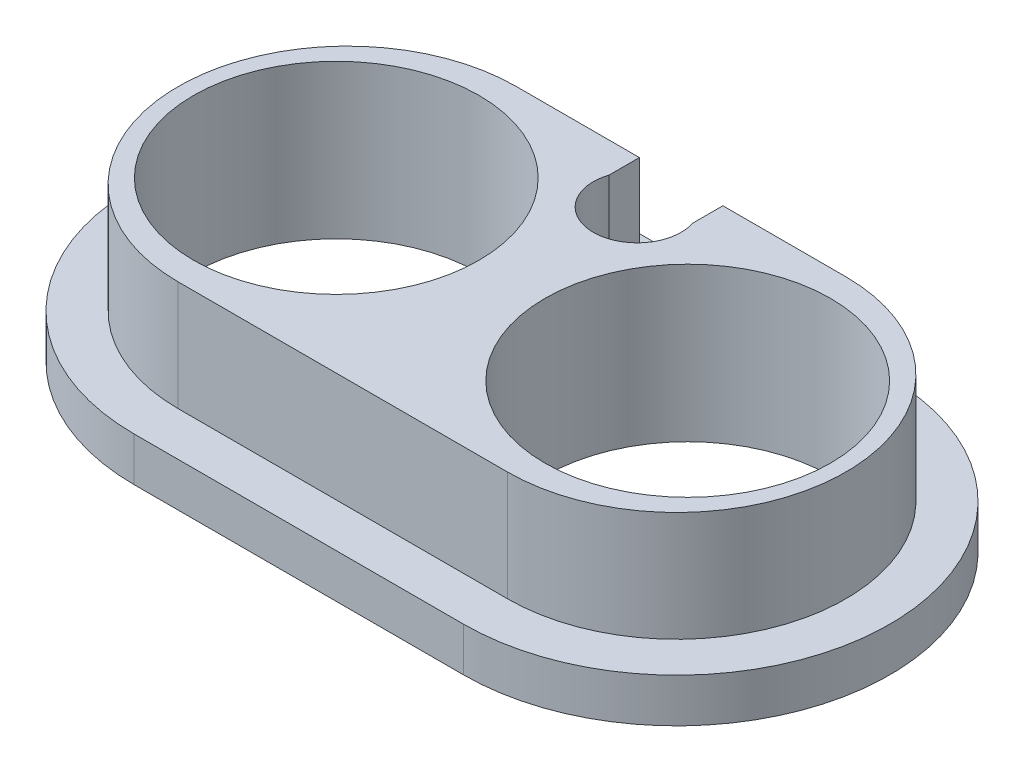
ISO-10303-21;
HEADER;
FILE_DESCRIPTION(('STEP AP214'),'2;1');
FILE_NAME('part.step','',(''),(''),'','','');
FILE_SCHEMA(('AUTOMOTIVE_DESIGN { 1 0 10303 214 1 1 1 1 }'));
ENDSEC;
DATA;
#1=APPLICATION_CONTEXT('core data for automotive mechanical design processes');
#2=APPLICATION_PROTOCOL_DEFINITION('international standard','automotive_design',2000,#1);
#3=PRODUCT_CONTEXT('',#1,'mechanical');
#4=PRODUCT('Part','Part','',(#3));
#5=PRODUCT_RELATED_PRODUCT_CATEGORY('part','',(#4));
#6=PRODUCT_DEFINITION_FORMATION('','',#4);
#7=PRODUCT_DEFINITION_CONTEXT('part definition',#1,'design');
#8=PRODUCT_DEFINITION('design','',#6,#7);
#9=PRODUCT_DEFINITION_SHAPE('','',#8);
#10=(LENGTH_UNIT() NAMED_UNIT(*) SI_UNIT(.MILLI.,.METRE.));
#11=(NAMED_UNIT(*) PLANE_ANGLE_UNIT() SI_UNIT($,.RADIAN.));
#12=(NAMED_UNIT(*) SI_UNIT($,.STERADIAN.) SOLID_ANGLE_UNIT());
#13=UNCERTAINTY_MEASURE_WITH_UNIT(LENGTH_MEASURE(1.E-05),#10,'distance_accuracy_value','');
#14=(GEOMETRIC_REPRESENTATION_CONTEXT(3) GLOBAL_UNCERTAINTY_ASSIGNED_CONTEXT((#13)) GLOBAL_UNIT_ASSIGNED_CONTEXT((#10,
#11,#12)) REPRESENTATION_CONTEXT('',''));
#15=CARTESIAN_POINT('',(0.,0.,0.));
#16=DIRECTION('',(0.,0.,1.));
#17=DIRECTION('',(1.,0.,0.));
#18=AXIS2_PLACEMENT_3D('',#15,#16,#17);
#19=CARTESIAN_POINT('',(-7.5,-2.,-9.7));
#20=DIRECTION('',(0.,0.,-1.));
#21=DIRECTION('',(-1.,0.,0.));
#22=AXIS2_PLACEMENT_3D('',#19,#20,#21);
#23=PLANE('',#22);
#24=DIRECTION('',(0.,-1.,0.));
#25=VECTOR('',#24,1.);
#26=CARTESIAN_POINT('',(1.9,5.001,-9.7));
#27=LINE('',#26,#25);
#28=CARTESIAN_POINT('',(1.9,0.,-9.7));
#29=VERTEX_POINT('',#28);
#30=CARTESIAN_POINT('',(1.9,-2.,-9.7));
#31=VERTEX_POINT('',#30);
#32=EDGE_CURVE('E176',#29,#31,#27,.T.);
#33=ORIENTED_EDGE('',*,*,#32,.F.);
#34=DIRECTION('',(-1.,0.,0.));
#35=VECTOR('',#34,1.);
#36=CARTESIAN_POINT('',(-7.5,0.,-9.7));
#37=LINE('',#36,#35);
#38=CARTESIAN_POINT('',(7.5,0.,-9.7));
#39=VERTEX_POINT('',#38);
#40=EDGE_CURVE('E187',#39,#29,#37,.T.);
#41=ORIENTED_EDGE('',*,*,#40,.F.);
#42=DIRECTION('',(0.,1.,0.));
#43=VECTOR('',#42,1.);
#44=CARTESIAN_POINT('',(7.5,-2.,-9.7));
#45=LINE('',#44,#43);
#46=CARTESIAN_POINT('',(7.5,-2.,-9.7));
#47=VERTEX_POINT('',#46);
#48=EDGE_CURVE('E79',#47,#39,#45,.T.);
#49=ORIENTED_EDGE('',*,*,#48,.F.);
#50=DIRECTION('',(-1.,0.,0.));
#51=VECTOR('',#50,1.);
#52=CARTESIAN_POINT('',(-7.5,-2.,-9.7));
#53=LINE('',#52,#51);
#54=EDGE_CURVE('E189',#47,#31,#53,.T.);
#55=ORIENTED_EDGE('',*,*,#54,.T.);
#56=EDGE_LOOP('',(#33,#41,#49,#55));
#57=FACE_BOUND('',#56,.T.);
#58=ADVANCED_FACE('F69',(#57),#23,.T.);
#59=CARTESIAN_POINT('',(-7.5,5.,-7.7));
#60=DIRECTION('',(0.,0.,-1.));
#61=DIRECTION('',(-1.,0.,0.));
#62=AXIS2_PLACEMENT_3D('',#59,#60,#61);
#63=PLANE('',#62);
#64=DIRECTION('',(0.,1.,0.));
#65=VECTOR('',#64,1.);
#66=CARTESIAN_POINT('',(1.9,5.001,-7.7));
#67=LINE('',#66,#65);
#68=CARTESIAN_POINT('',(1.9,0.,-7.7));
#69=VERTEX_POINT('',#68);
#70=CARTESIAN_POINT('',(1.9,5.,-7.7));
#71=VERTEX_POINT('',#70);
#72=EDGE_CURVE('E179',#69,#71,#67,.T.);
#73=ORIENTED_EDGE('',*,*,#72,.T.);
#74=DIRECTION('',(1.,0.,0.));
#75=VECTOR('',#74,1.);
#76=CARTESIAN_POINT('',(-7.5,5.,-7.7));
#77=LINE('',#76,#75);
#78=CARTESIAN_POINT('',(7.5,5.,-7.7));
#79=VERTEX_POINT('',#78);
#80=EDGE_CURVE('E298',#71,#79,#77,.T.);
#81=ORIENTED_EDGE('',*,*,#80,.T.);
#82=DIRECTION('',(0.,-1.,0.));
#83=VECTOR('',#82,1.);
#84=CARTESIAN_POINT('',(7.5,5.,-7.7));
#85=LINE('',#84,#83);
#86=CARTESIAN_POINT('',(7.5,0.,-7.7));
#87=VERTEX_POINT('',#86);
#88=EDGE_CURVE('E308',#79,#87,#85,.T.);
#89=ORIENTED_EDGE('',*,*,#88,.T.);
#90=DIRECTION('',(1.,0.,0.));
#91=VECTOR('',#90,1.);
#92=CARTESIAN_POINT('',(-7.5,0.,-7.7));
#93=LINE('',#92,#91);
#94=EDGE_CURVE('E95',#69,#87,#93,.T.);
#95=ORIENTED_EDGE('',*,*,#94,.F.);
#96=EDGE_LOOP('',(#73,#81,#89,#95));
#97=FACE_BOUND('',#96,.T.);
#98=ADVANCED_FACE('F339',(#97),#63,.T.);
#99=CARTESIAN_POINT('',(-7.5,0.,0.));
#100=DIRECTION('',(0.,1.,0.));
#101=DIRECTION('',(0.,0.,1.));
#102=AXIS2_PLACEMENT_3D('',#99,#100,#101);
#103=PLANE('',#102);
#104=DIRECTION('',(0.,0.,1.));
#105=VECTOR('',#104,1.);
#106=CARTESIAN_POINT('',(1.9,0.,0.));
#107=LINE('',#106,#105);
#108=EDGE_CURVE('E172',#29,#69,#107,.T.);
#109=ORIENTED_EDGE('',*,*,#108,.T.);
#110=ORIENTED_EDGE('',*,*,#94,.T.);
#111=CARTESIAN_POINT('',(7.5,0.,0.));
#112=DIRECTION('',(0.,1.,0.));
#113=DIRECTION('',(0.,0.,1.));
#114=AXIS2_PLACEMENT_3D('',#111,#112,#113);
#115=CIRCLE('',#114,7.7);
#116=CARTESIAN_POINT('',(7.5,0.,7.7));
#117=VERTEX_POINT('',#116);
#118=EDGE_CURVE('E313',#117,#87,#115,.T.);
#119=ORIENTED_EDGE('',*,*,#118,.F.);
#120=DIRECTION('',(1.,0.,0.));
#121=VECTOR('',#120,1.);
#122=CARTESIAN_POINT('',(-7.5,0.,7.7));
#123=LINE('',#122,#121);
#124=CARTESIAN_POINT('',(-7.5,0.,7.7));
#125=VERTEX_POINT('',#124);
#126=EDGE_CURVE('E317',#125,#117,#123,.T.);
#127=ORIENTED_EDGE('',*,*,#126,.F.);
#128=CARTESIAN_POINT('',(-7.5,0.,0.));
#129=DIRECTION('',(0.,1.,0.));
#130=DIRECTION('',(0.,0.,1.));
#131=AXIS2_PLACEMENT_3D('',#128,#129,#130);
#132=CIRCLE('',#131,7.7);
#133=CARTESIAN_POINT('',(-7.5,0.,-7.7));
#134=VERTEX_POINT('',#133);
#135=EDGE_CURVE('E321',#134,#125,#132,.T.);
#136=ORIENTED_EDGE('',*,*,#135,.F.);
#137=CARTESIAN_POINT('',(-1.9,0.,-7.7));
#138=VERTEX_POINT('',#137);
#139=EDGE_CURVE('E309',#134,#138,#93,.T.);
#140=ORIENTED_EDGE('',*,*,#139,.T.);
#141=DIRECTION('',(0.,0.,-1.));
#142=VECTOR('',#141,1.);
#143=CARTESIAN_POINT('',(-1.9,0.,0.));
#144=LINE('',#143,#142);
#145=CARTESIAN_POINT('',(-1.9,0.,-9.7));
#146=VERTEX_POINT('',#145);
#147=EDGE_CURVE('E273',#138,#146,#144,.T.);
#148=ORIENTED_EDGE('',*,*,#147,.T.);
#149=CARTESIAN_POINT('',(-7.5,0.,-9.7));
#150=VERTEX_POINT('',#149);
#151=EDGE_CURVE('E201',#146,#150,#37,.T.);
#152=ORIENTED_EDGE('',*,*,#151,.T.);
#153=CARTESIAN_POINT('',(-7.5,0.,0.));
#154=DIRECTION('',(0.,1.,0.));
#155=DIRECTION('',(0.,0.,1.));
#156=AXIS2_PLACEMENT_3D('',#153,#154,#155);
#157=CIRCLE('',#156,9.7);
#158=CARTESIAN_POINT('',(-7.5,0.,9.7));
#159=VERTEX_POINT('',#158);
#160=EDGE_CURVE('E228',#150,#159,#157,.T.);
#161=ORIENTED_EDGE('',*,*,#160,.T.);
#162=DIRECTION('',(1.,0.,0.));
#163=VECTOR('',#162,1.);
#164=CARTESIAN_POINT('',(-7.5,0.,9.7));
#165=LINE('',#164,#163);
#166=CARTESIAN_POINT('',(7.5,0.,9.7));
#167=VERTEX_POINT('',#166);
#168=EDGE_CURVE('E231',#159,#167,#165,.T.);
#169=ORIENTED_EDGE('',*,*,#168,.T.);
#170=CARTESIAN_POINT('',(7.5,0.,0.));
#171=DIRECTION('',(0.,1.,0.));
#172=DIRECTION('',(0.,0.,1.));
#173=AXIS2_PLACEMENT_3D('',#170,#171,#172);
#174=CIRCLE('',#173,9.7);
#175=EDGE_CURVE('E198',#167,#39,#174,.T.);
#176=ORIENTED_EDGE('',*,*,#175,.T.);
#177=ORIENTED_EDGE('',*,*,#40,.T.);
#178=EDGE_LOOP('',(#109,#110,#119,#127,#136,#140,#148,#152,#161,#169,#176,#177));
#179=FACE_BOUND('',#178,.T.);
#180=ADVANCED_FACE('F195',(#179),#103,.T.);
#181=CARTESIAN_POINT('',(-7.5,-2.,0.));
#182=DIRECTION('',(0.,1.,0.));
#183=DIRECTION('',(0.,0.,1.));
#184=AXIS2_PLACEMENT_3D('',#181,#182,#183);
#185=CYLINDRICAL_SURFACE('',#184,9.7);
#186=ORIENTED_EDGE('',*,*,#160,.F.);
#187=DIRECTION('',(0.,1.,0.));
#188=VECTOR('',#187,1.);
#189=CARTESIAN_POINT('',(-7.5,-2.,-9.7));
#190=LINE('',#189,#188);
#191=CARTESIAN_POINT('',(-7.5,-2.,-9.7));
#192=VERTEX_POINT('',#191);
#193=EDGE_CURVE('E12',#192,#150,#190,.T.);
#194=ORIENTED_EDGE('',*,*,#193,.F.);
#195=CARTESIAN_POINT('',(-7.5,-2.,0.));
#196=DIRECTION('',(0.,1.,0.));
#197=DIRECTION('',(0.,0.,1.));
#198=AXIS2_PLACEMENT_3D('',#195,#196,#197);
#199=CIRCLE('',#198,9.7);
#200=CARTESIAN_POINT('',(-7.5,-2.,9.7));
#201=VERTEX_POINT('',#200);
#202=EDGE_CURVE('E200',#192,#201,#199,.T.);
#203=ORIENTED_EDGE('',*,*,#202,.T.);
#204=DIRECTION('',(0.,1.,0.));
#205=VECTOR('',#204,1.);
#206=CARTESIAN_POINT('',(-7.5,-2.,9.7));
#207=LINE('',#206,#205);
#208=EDGE_CURVE('E73',#201,#159,#207,.T.);
#209=ORIENTED_EDGE('',*,*,#208,.T.);
#210=EDGE_LOOP('',(#186,#194,#203,#209));
#211=FACE_BOUND('',#210,.T.);
#212=ADVANCED_FACE('F71',(#211),#185,.T.);
#213=DIRECTION('',(0.,-1.,0.));
#214=VECTOR('',#213,1.);
#215=CARTESIAN_POINT('',(-1.9,5.001,-9.7));
#216=LINE('',#215,#214);
#217=CARTESIAN_POINT('',(-1.9,-2.,-9.7));
#218=VERTEX_POINT('',#217);
#219=EDGE_CURVE('E192',#146,#218,#216,.T.);
#220=ORIENTED_EDGE('',*,*,#219,.T.);
#221=EDGE_CURVE('E221',#218,#192,#53,.T.);
#222=ORIENTED_EDGE('',*,*,#221,.T.);
#223=ORIENTED_EDGE('',*,*,#193,.T.);
#224=ORIENTED_EDGE('',*,*,#151,.F.);
#225=EDGE_LOOP('',(#220,#222,#223,#224));
#226=FACE_BOUND('',#225,.T.);
#227=ADVANCED_FACE('F249',(#226),#23,.T.);
#228=CARTESIAN_POINT('',(7.5,-2.,0.));
#229=DIRECTION('',(0.,1.,0.));
#230=DIRECTION('',(0.,0.,1.));
#231=AXIS2_PLACEMENT_3D('',#228,#229,#230);
#232=CYLINDRICAL_SURFACE('',#231,9.7);
#233=ORIENTED_EDGE('',*,*,#175,.F.);
#234=DIRECTION('',(0.,1.,0.));
#235=VECTOR('',#234,1.);
#236=CARTESIAN_POINT('',(7.5,-2.,9.7));
#237=LINE('',#236,#235);
#238=CARTESIAN_POINT('',(7.5,-2.,9.7));
#239=VERTEX_POINT('',#238);
#240=EDGE_CURVE('E212',#239,#167,#237,.T.);
#241=ORIENTED_EDGE('',*,*,#240,.F.);
#242=CARTESIAN_POINT('',(7.5,-2.,0.));
#243=DIRECTION('',(0.,1.,0.));
#244=DIRECTION('',(0.,0.,1.));
#245=AXIS2_PLACEMENT_3D('',#242,#243,#244);
#246=CIRCLE('',#245,9.7);
#247=EDGE_CURVE('E224',#239,#47,#246,.T.);
#248=ORIENTED_EDGE('',*,*,#247,.T.);
#249=ORIENTED_EDGE('',*,*,#48,.T.);
#250=EDGE_LOOP('',(#233,#241,#248,#249));
#251=FACE_BOUND('',#250,.T.);
#252=ADVANCED_FACE('F397',(#251),#232,.T.);
#253=CARTESIAN_POINT('',(-7.5,-2.,9.7));
#254=DIRECTION('',(0.,0.,1.));
#255=DIRECTION('',(1.,0.,0.));
#256=AXIS2_PLACEMENT_3D('',#253,#254,#255);
#257=PLANE('',#256);
#258=ORIENTED_EDGE('',*,*,#168,.F.);
#259=ORIENTED_EDGE('',*,*,#208,.F.);
#260=DIRECTION('',(1.,0.,0.));
#261=VECTOR('',#260,1.);
#262=CARTESIAN_POINT('',(-7.5,-2.,9.7));
#263=LINE('',#262,#261);
#264=EDGE_CURVE('E206',#201,#239,#263,.T.);
#265=ORIENTED_EDGE('',*,*,#264,.T.);
#266=ORIENTED_EDGE('',*,*,#240,.T.);
#267=EDGE_LOOP('',(#258,#259,#265,#266));
#268=FACE_BOUND('',#267,.T.);
#269=ADVANCED_FACE('F235',(#268),#257,.T.);
#270=CARTESIAN_POINT('',(-7.5,-2.,0.));
#271=DIRECTION('',(0.,1.,0.));
#272=DIRECTION('',(0.,0.,1.));
#273=AXIS2_PLACEMENT_3D('',#270,#271,#272);
#274=PLANE('',#273);
#275=CARTESIAN_POINT('',(8.,-2.,0.));
#276=DIRECTION('',(0.,-1.,0.));
#277=DIRECTION('',(0.,0.,-1.));
#278=AXIS2_PLACEMENT_3D('',#275,#276,#277);
#279=CIRCLE('',#278,6.5);
#280=CARTESIAN_POINT('',(8.,-2.,-6.5));
#281=VERTEX_POINT('',#280);
#282=EDGE_CURVE('E278',#281,#281,#279,.T.);
#283=ORIENTED_EDGE('',*,*,#282,.F.);
#284=EDGE_LOOP('',(#283));
#285=FACE_BOUND('',#284,.T.);
#286=CARTESIAN_POINT('',(-8.,-2.,0.));
#287=DIRECTION('',(0.,-1.,0.));
#288=DIRECTION('',(0.,0.,-1.));
#289=AXIS2_PLACEMENT_3D('',#286,#287,#288);
#290=CIRCLE('',#289,6.5);
#291=CARTESIAN_POINT('',(-8.,-2.,-6.5));
#292=VERTEX_POINT('',#291);
#293=EDGE_CURVE('E286',#292,#292,#290,.T.);
#294=ORIENTED_EDGE('',*,*,#293,.F.);
#295=EDGE_LOOP('',(#294));
#296=FACE_BOUND('',#295,.T.);
#297=CARTESIAN_POINT('',(0.,-2.,-5.7));
#298=DIRECTION('',(0.,-1.,0.));
#299=DIRECTION('',(0.,0.,-1.));
#300=AXIS2_PLACEMENT_3D('',#297,#298,#299);
#301=CIRCLE('',#300,2.);
#302=CARTESIAN_POINT('',(-1.9,-2.,-6.32449979983984));
#303=VERTEX_POINT('',#302);
#304=CARTESIAN_POINT('',(1.9,-2.,-6.32449979983984));
#305=VERTEX_POINT('',#304);
#306=EDGE_CURVE('E182',#303,#305,#301,.F.);
#307=ORIENTED_EDGE('',*,*,#306,.T.);
#308=DIRECTION('',(0.,0.,1.));
#309=VECTOR('',#308,1.);
#310=CARTESIAN_POINT('',(1.9,-2.,0.));
#311=LINE('',#310,#309);
#312=EDGE_CURVE('E254',#31,#305,#311,.T.);
#313=ORIENTED_EDGE('',*,*,#312,.F.);
#314=ORIENTED_EDGE('',*,*,#54,.F.);
#315=ORIENTED_EDGE('',*,*,#247,.F.);
#316=ORIENTED_EDGE('',*,*,#264,.F.);
#317=ORIENTED_EDGE('',*,*,#202,.F.);
#318=ORIENTED_EDGE('',*,*,#221,.F.);
#319=DIRECTION('',(0.,0.,-1.));
#320=VECTOR('',#319,1.);
#321=CARTESIAN_POINT('',(-1.9,-2.,0.));
#322=LINE('',#321,#320);
#323=EDGE_CURVE('E251',#303,#218,#322,.T.);
#324=ORIENTED_EDGE('',*,*,#323,.F.);
#325=EDGE_LOOP('',(#307,#313,#314,#315,#316,#317,#318,#324));
#326=FACE_BOUND('',#325,.T.);
#327=ADVANCED_FACE('F241',(#285,#296,#326),#274,.F.);
#328=DIRECTION('',(0.,-1.,0.));
#329=VECTOR('',#328,1.);
#330=CARTESIAN_POINT('',(-1.9,5.001,-7.7));
#331=LINE('',#330,#329);
#332=CARTESIAN_POINT('',(-1.9,5.,-7.7));
#333=VERTEX_POINT('',#332);
#334=EDGE_CURVE('E87',#333,#138,#331,.T.);
#335=ORIENTED_EDGE('',*,*,#334,.T.);
#336=ORIENTED_EDGE('',*,*,#139,.F.);
#337=DIRECTION('',(0.,-1.,0.));
#338=VECTOR('',#337,1.);
#339=CARTESIAN_POINT('',(-7.5,5.,-7.7));
#340=LINE('',#339,#338);
#341=CARTESIAN_POINT('',(-7.5,5.,-7.7));
#342=VERTEX_POINT('',#341);
#343=EDGE_CURVE('E232',#342,#134,#340,.T.);
#344=ORIENTED_EDGE('',*,*,#343,.F.);
#345=EDGE_CURVE('E293',#342,#333,#77,.T.);
#346=ORIENTED_EDGE('',*,*,#345,.T.);
#347=EDGE_LOOP('',(#335,#336,#344,#346));
#348=FACE_BOUND('',#347,.T.);
#349=ADVANCED_FACE('F355',(#348),#63,.T.);
#350=CARTESIAN_POINT('',(-7.5,5.,0.));
#351=DIRECTION('',(0.,-1.,0.));
#352=DIRECTION('',(0.,0.,-1.));
#353=AXIS2_PLACEMENT_3D('',#350,#351,#352);
#354=CYLINDRICAL_SURFACE('',#353,7.7);
#355=ORIENTED_EDGE('',*,*,#135,.T.);
#356=DIRECTION('',(0.,-1.,0.));
#357=VECTOR('',#356,1.);
#358=CARTESIAN_POINT('',(-7.5,5.,7.7));
#359=LINE('',#358,#357);
#360=CARTESIAN_POINT('',(-7.5,5.,7.7));
#361=VERTEX_POINT('',#360);
#362=EDGE_CURVE('E328',#361,#125,#359,.T.);
#363=ORIENTED_EDGE('',*,*,#362,.F.);
#364=CARTESIAN_POINT('',(-7.5,5.,0.));
#365=DIRECTION('',(0.,1.,0.));
#366=DIRECTION('',(0.,0.,1.));
#367=AXIS2_PLACEMENT_3D('',#364,#365,#366);
#368=CIRCLE('',#367,7.7);
#369=EDGE_CURVE('E305',#342,#361,#368,.T.);
#370=ORIENTED_EDGE('',*,*,#369,.F.);
#371=ORIENTED_EDGE('',*,*,#343,.T.);
#372=EDGE_LOOP('',(#355,#363,#370,#371));
#373=FACE_BOUND('',#372,.T.);
#374=ADVANCED_FACE('F351',(#373),#354,.T.);
#375=CARTESIAN_POINT('',(-7.5,5.,7.7));
#376=DIRECTION('',(0.,0.,-1.));
#377=DIRECTION('',(-1.,0.,0.));
#378=AXIS2_PLACEMENT_3D('',#375,#376,#377);
#379=PLANE('',#378);
#380=ORIENTED_EDGE('',*,*,#126,.T.);
#381=DIRECTION('',(0.,-1.,0.));
#382=VECTOR('',#381,1.);
#383=CARTESIAN_POINT('',(7.5,5.,7.7));
#384=LINE('',#383,#382);
#385=CARTESIAN_POINT('',(7.5,5.,7.7));
#386=VERTEX_POINT('',#385);
#387=EDGE_CURVE('E332',#386,#117,#384,.T.);
#388=ORIENTED_EDGE('',*,*,#387,.F.);
#389=DIRECTION('',(1.,0.,0.));
#390=VECTOR('',#389,1.);
#391=CARTESIAN_POINT('',(-7.5,5.,7.7));
#392=LINE('',#391,#390);
#393=EDGE_CURVE('E302',#361,#386,#392,.T.);
#394=ORIENTED_EDGE('',*,*,#393,.F.);
#395=ORIENTED_EDGE('',*,*,#362,.T.);
#396=EDGE_LOOP('',(#380,#388,#394,#395));
#397=FACE_BOUND('',#396,.T.);
#398=ADVANCED_FACE('F346',(#397),#379,.F.);
#399=CARTESIAN_POINT('',(7.5,5.,0.));
#400=DIRECTION('',(0.,-1.,0.));
#401=DIRECTION('',(0.,0.,-1.));
#402=AXIS2_PLACEMENT_3D('',#399,#400,#401);
#403=CYLINDRICAL_SURFACE('',#402,7.7);
#404=ORIENTED_EDGE('',*,*,#118,.T.);
#405=ORIENTED_EDGE('',*,*,#88,.F.);
#406=CARTESIAN_POINT('',(7.5,5.,0.));
#407=DIRECTION('',(0.,1.,0.));
#408=DIRECTION('',(0.,0.,1.));
#409=AXIS2_PLACEMENT_3D('',#406,#407,#408);
#410=CIRCLE('',#409,7.7);
#411=EDGE_CURVE('E297',#386,#79,#410,.T.);
#412=ORIENTED_EDGE('',*,*,#411,.F.);
#413=ORIENTED_EDGE('',*,*,#387,.T.);
#414=EDGE_LOOP('',(#404,#405,#412,#413));
#415=FACE_BOUND('',#414,.T.);
#416=ADVANCED_FACE('F343',(#415),#403,.T.);
#417=CARTESIAN_POINT('',(7.5,5.,0.));
#418=DIRECTION('',(0.,1.,0.));
#419=DIRECTION('',(0.,0.,1.));
#420=AXIS2_PLACEMENT_3D('',#417,#418,#419);
#421=PLANE('',#420);
#422=CARTESIAN_POINT('',(8.,5.,0.));
#423=DIRECTION('',(0.,1.,0.));
#424=DIRECTION('',(0.,0.,1.));
#425=AXIS2_PLACEMENT_3D('',#422,#423,#424);
#426=CIRCLE('',#425,6.5);
#427=CARTESIAN_POINT('',(8.,5.,6.5));
#428=VERTEX_POINT('',#427);
#429=EDGE_CURVE('E277',#428,#428,#426,.F.);
#430=ORIENTED_EDGE('',*,*,#429,.T.);
#431=EDGE_LOOP('',(#430));
#432=FACE_BOUND('',#431,.T.);
#433=DIRECTION('',(0.,0.,1.));
#434=VECTOR('',#433,1.);
#435=CARTESIAN_POINT('',(1.9,5.,0.));
#436=LINE('',#435,#434);
#437=CARTESIAN_POINT('',(1.9,5.,-6.32449979983984));
#438=VERTEX_POINT('',#437);
#439=EDGE_CURVE('E367',#71,#438,#436,.T.);
#440=ORIENTED_EDGE('',*,*,#439,.T.);
#441=CARTESIAN_POINT('',(0.,5.,-5.7));
#442=DIRECTION('',(0.,1.,0.));
#443=DIRECTION('',(0.,0.,1.));
#444=AXIS2_PLACEMENT_3D('',#441,#442,#443);
#445=CIRCLE('',#444,2.);
#446=CARTESIAN_POINT('',(-1.9,5.,-6.32449979983984));
#447=VERTEX_POINT('',#446);
#448=EDGE_CURVE('E361',#447,#438,#445,.T.);
#449=ORIENTED_EDGE('',*,*,#448,.F.);
#450=DIRECTION('',(0.,0.,-1.));
#451=VECTOR('',#450,1.);
#452=CARTESIAN_POINT('',(-1.9,5.,0.));
#453=LINE('',#452,#451);
#454=EDGE_CURVE('E263',#447,#333,#453,.T.);
#455=ORIENTED_EDGE('',*,*,#454,.T.);
#456=ORIENTED_EDGE('',*,*,#345,.F.);
#457=ORIENTED_EDGE('',*,*,#369,.T.);
#458=ORIENTED_EDGE('',*,*,#393,.T.);
#459=ORIENTED_EDGE('',*,*,#411,.T.);
#460=ORIENTED_EDGE('',*,*,#80,.F.);
#461=EDGE_LOOP('',(#440,#449,#455,#456,#457,#458,#459,#460));
#462=FACE_BOUND('',#461,.T.);
#463=CARTESIAN_POINT('',(-8.,5.,0.));
#464=DIRECTION('',(0.,1.,0.));
#465=DIRECTION('',(0.,0.,1.));
#466=AXIS2_PLACEMENT_3D('',#463,#464,#465);
#467=CIRCLE('',#466,6.5);
#468=CARTESIAN_POINT('',(-8.,5.,6.5));
#469=VERTEX_POINT('',#468);
#470=EDGE_CURVE('E282',#469,#469,#467,.F.);
#471=ORIENTED_EDGE('',*,*,#470,.T.);
#472=EDGE_LOOP('',(#471));
#473=FACE_BOUND('',#472,.T.);
#474=ADVANCED_FACE('F358',(#432,#462,#473),#421,.T.);
#475=CARTESIAN_POINT('',(-8.,5.001,0.));
#476=DIRECTION('',(0.,-1.,0.));
#477=DIRECTION('',(0.,0.,-1.));
#478=AXIS2_PLACEMENT_3D('',#475,#476,#477);
#479=CYLINDRICAL_SURFACE('',#478,6.5);
#480=ORIENTED_EDGE('',*,*,#470,.F.);
#481=EDGE_LOOP('',(#480));
#482=FACE_BOUND('',#481,.T.);
#483=ORIENTED_EDGE('',*,*,#293,.T.);
#484=EDGE_LOOP('',(#483));
#485=FACE_BOUND('',#484,.T.);
#486=ADVANCED_FACE('F377',(#482,#485),#479,.F.);
#487=CARTESIAN_POINT('',(0.,5.001,-5.7));
#488=DIRECTION('',(0.,-1.,0.));
#489=DIRECTION('',(0.,0.,-1.));
#490=AXIS2_PLACEMENT_3D('',#487,#488,#489);
#491=CYLINDRICAL_SURFACE('',#490,2.);
#492=ORIENTED_EDGE('',*,*,#448,.T.);
#493=DIRECTION('',(0.,-1.,0.));
#494=VECTOR('',#493,1.);
#495=CARTESIAN_POINT('',(1.9,5.001,-6.32449979983984));
#496=LINE('',#495,#494);
#497=EDGE_CURVE('E191',#438,#305,#496,.T.);
#498=ORIENTED_EDGE('',*,*,#497,.T.);
#499=ORIENTED_EDGE('',*,*,#306,.F.);
#500=DIRECTION('',(0.,-1.,0.));
#501=VECTOR('',#500,1.);
#502=CARTESIAN_POINT('',(-1.9,5.001,-6.32449979983984));
#503=LINE('',#502,#501);
#504=EDGE_CURVE('E258',#447,#303,#503,.T.);
#505=ORIENTED_EDGE('',*,*,#504,.F.);
#506=EDGE_LOOP('',(#492,#498,#499,#505));
#507=FACE_BOUND('',#506,.T.);
#508=ADVANCED_FACE('F365',(#507),#491,.F.);
#509=CARTESIAN_POINT('',(1.9,5.001,0.));
#510=DIRECTION('',(1.,0.,0.));
#511=DIRECTION('',(0.,0.,-1.));
#512=AXIS2_PLACEMENT_3D('',#509,#510,#511);
#513=PLANE('',#512);
#514=ORIENTED_EDGE('',*,*,#32,.T.);
#515=ORIENTED_EDGE('',*,*,#312,.T.);
#516=ORIENTED_EDGE('',*,*,#497,.F.);
#517=ORIENTED_EDGE('',*,*,#439,.F.);
#518=ORIENTED_EDGE('',*,*,#72,.F.);
#519=ORIENTED_EDGE('',*,*,#108,.F.);
#520=EDGE_LOOP('',(#514,#515,#516,#517,#518,#519));
#521=FACE_BOUND('',#520,.T.);
#522=ADVANCED_FACE('F174',(#521),#513,.F.);
#523=CARTESIAN_POINT('',(-1.9,5.001,0.));
#524=DIRECTION('',(-1.,0.,0.));
#525=DIRECTION('',(0.,0.,1.));
#526=AXIS2_PLACEMENT_3D('',#523,#524,#525);
#527=PLANE('',#526);
#528=ORIENTED_EDGE('',*,*,#334,.F.);
#529=ORIENTED_EDGE('',*,*,#454,.F.);
#530=ORIENTED_EDGE('',*,*,#504,.T.);
#531=ORIENTED_EDGE('',*,*,#323,.T.);
#532=ORIENTED_EDGE('',*,*,#219,.F.);
#533=ORIENTED_EDGE('',*,*,#147,.F.);
#534=EDGE_LOOP('',(#528,#529,#530,#531,#532,#533));
#535=FACE_BOUND('',#534,.T.);
#536=ADVANCED_FACE('F363',(#535),#527,.F.);
#537=CARTESIAN_POINT('',(8.,5.001,0.));
#538=DIRECTION('',(0.,-1.,0.));
#539=DIRECTION('',(0.,0.,-1.));
#540=AXIS2_PLACEMENT_3D('',#537,#538,#539);
#541=CYLINDRICAL_SURFACE('',#540,6.5);
#542=ORIENTED_EDGE('',*,*,#429,.F.);
#543=EDGE_LOOP('',(#542));
#544=FACE_BOUND('',#543,.T.);
#545=ORIENTED_EDGE('',*,*,#282,.T.);
#546=EDGE_LOOP('',(#545));
#547=FACE_BOUND('',#546,.T.);
#548=ADVANCED_FACE('F421',(#544,#547),#541,.F.);
#549=CLOSED_SHELL('',(#58,#98,#180,#212,#227,#252,#269,#327,#349,#374,#398,#416,#474,#486,#508,
#522,#536,#548));
#550=MANIFOLD_SOLID_BREP('B2',#549);
#551=ADVANCED_BREP_SHAPE_REPRESENTATION('',(#18,#550),#14);
#552=SHAPE_DEFINITION_REPRESENTATION(#9,#551);
ENDSEC;
END-ISO-10303-21;
